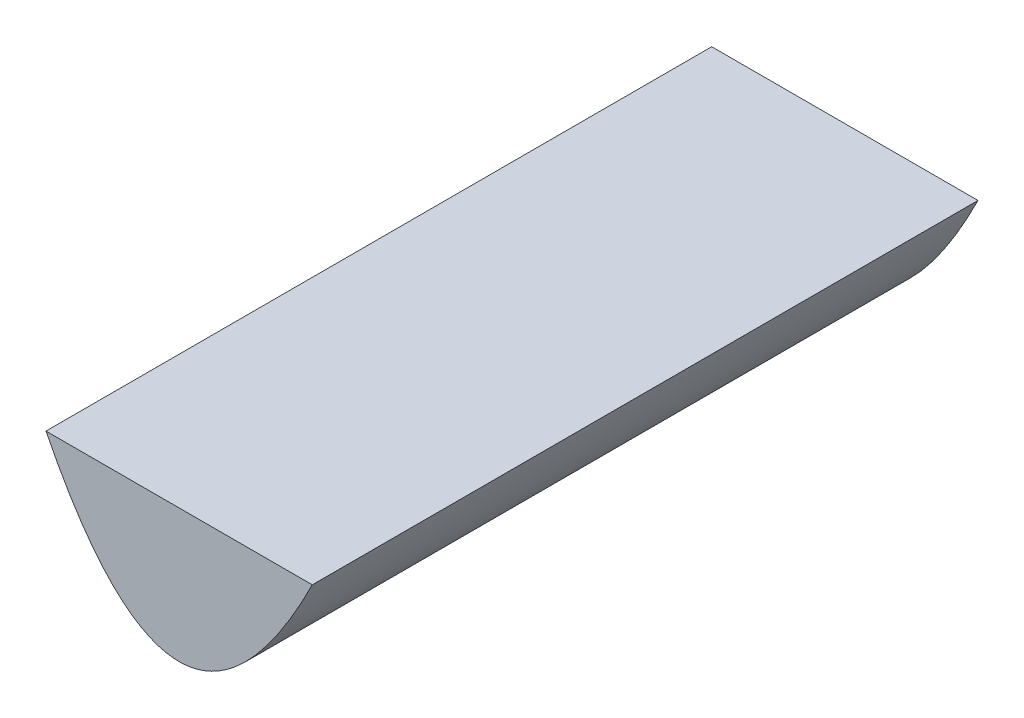
ISO-10303-21;
HEADER;
FILE_DESCRIPTION(('STEP AP214'),'2;1');
FILE_NAME('part.step','',(''),(''),'','','');
FILE_SCHEMA(('AUTOMOTIVE_DESIGN { 1 0 10303 214 1 1 1 1 }'));
ENDSEC;
DATA;
#1=APPLICATION_CONTEXT('core data for automotive mechanical design processes');
#2=APPLICATION_PROTOCOL_DEFINITION('international standard','automotive_design',2000,#1);
#3=PRODUCT_CONTEXT('',#1,'mechanical');
#4=PRODUCT('Part','Part','',(#3));
#5=PRODUCT_RELATED_PRODUCT_CATEGORY('part','',(#4));
#6=PRODUCT_DEFINITION_FORMATION('','',#4);
#7=PRODUCT_DEFINITION_CONTEXT('part definition',#1,'design');
#8=PRODUCT_DEFINITION('design','',#6,#7);
#9=PRODUCT_DEFINITION_SHAPE('','',#8);
#10=(LENGTH_UNIT() NAMED_UNIT(*) SI_UNIT(.MILLI.,.METRE.));
#11=(NAMED_UNIT(*) PLANE_ANGLE_UNIT() SI_UNIT($,.RADIAN.));
#12=(NAMED_UNIT(*) SI_UNIT($,.STERADIAN.) SOLID_ANGLE_UNIT());
#13=UNCERTAINTY_MEASURE_WITH_UNIT(LENGTH_MEASURE(1.E-05),#10,'distance_accuracy_value','');
#14=(GEOMETRIC_REPRESENTATION_CONTEXT(3) GLOBAL_UNCERTAINTY_ASSIGNED_CONTEXT((#13)) GLOBAL_UNIT_ASSIGNED_CONTEXT((#10,
#11,#12)) REPRESENTATION_CONTEXT('',''));
#15=CARTESIAN_POINT('',(0.,0.,0.));
#16=DIRECTION('',(0.,0.,1.));
#17=DIRECTION('',(1.,0.,0.));
#18=AXIS2_PLACEMENT_3D('',#15,#16,#17);
#19=CARTESIAN_POINT('',(-1.58805373498568E-05,-19.0909225266953,329.545454545455));
#20=DIRECTION('',(0.,0.,-1.));
#21=DIRECTION('',(-1.,0.,0.));
#22=AXIS2_PLACEMENT_3D('',#19,#20,#21);
#23=PLANE('',#22);
#24=CARTESIAN_POINT('',(-131.818197698487,112.72725929053,329.545454545455));
#25=CARTESIAN_POINT('',(-1.58805373590035E-05,-150.909104344412,329.545454545455));
#26=CARTESIAN_POINT('',(131.818165937412,112.727259291513,329.545454545455));
#27=B_SPLINE_CURVE_WITH_KNOTS('',2,(#24,#25,#26),.UNSPECIFIED.,.F.,.F.,(3,3),(0.274263764944984,
0.725736235055858),.UNSPECIFIED.);
#28=CARTESIAN_POINT('',(-131.81819769897,112.727259291471,329.545454545455));
#29=VERTEX_POINT('',#28);
#30=CARTESIAN_POINT('',(131.818165937446,112.727259291471,329.545454545455));
#31=VERTEX_POINT('',#30);
#32=EDGE_CURVE('E62',#29,#31,#27,.T.);
#33=ORIENTED_EDGE('',*,*,#32,.T.);
#34=DIRECTION('',(-1.,0.,0.));
#35=VECTOR('',#34,1.);
#36=CARTESIAN_POINT('',(-131.81819769897,112.727259291471,329.545454545455));
#37=LINE('',#36,#35);
#38=EDGE_CURVE('E68',#31,#29,#37,.T.);
#39=ORIENTED_EDGE('',*,*,#38,.T.);
#40=EDGE_LOOP('',(#33,#39));
#41=FACE_BOUND('',#40,.T.);
#42=ADVANCED_FACE('F37',(#41),#23,.F.);
#43=CARTESIAN_POINT('',(-1.58805373498568E-05,-19.0909225266953,-329.545454545455));
#44=DIRECTION('',(0.,0.,-1.));
#45=DIRECTION('',(-1.,0.,0.));
#46=AXIS2_PLACEMENT_3D('',#43,#44,#45);
#47=PLANE('',#46);
#48=CARTESIAN_POINT('',(-131.818197698487,112.72725929053,-329.545454545455));
#49=CARTESIAN_POINT('',(-1.58805373590035E-05,-150.909104344412,-329.545454545455));
#50=CARTESIAN_POINT('',(131.818165937412,112.727259291513,-329.545454545455));
#51=B_SPLINE_CURVE_WITH_KNOTS('',2,(#48,#49,#50),.UNSPECIFIED.,.F.,.F.,(3,3),(0.274263764944984,
0.725736235055858),.UNSPECIFIED.);
#52=CARTESIAN_POINT('',(-131.81819769897,112.727259291471,-329.545454545455));
#53=VERTEX_POINT('',#52);
#54=CARTESIAN_POINT('',(131.818165937446,112.727259291471,-329.545454545455));
#55=VERTEX_POINT('',#54);
#56=EDGE_CURVE('E44',#53,#55,#51,.T.);
#57=ORIENTED_EDGE('',*,*,#56,.F.);
#58=DIRECTION('',(-1.,0.,0.));
#59=VECTOR('',#58,1.);
#60=CARTESIAN_POINT('',(-131.81819769897,112.727259291471,-329.545454545455));
#61=LINE('',#60,#59);
#62=EDGE_CURVE('E11',#55,#53,#61,.T.);
#63=ORIENTED_EDGE('',*,*,#62,.F.);
#64=EDGE_LOOP('',(#57,#63));
#65=FACE_BOUND('',#64,.T.);
#66=ADVANCED_FACE('F89',(#65),#47,.T.);
#67=CARTESIAN_POINT('',(-131.818197698487,112.72725929053,329.545454545455));
#68=CARTESIAN_POINT('',(-131.818197698487,112.72725929053,-329.545454545455));
#69=CARTESIAN_POINT('',(-1.58805373590035E-05,-150.909104344412,329.545454545455));
#70=CARTESIAN_POINT('',(-1.58805373590035E-05,-150.909104344412,-329.545454545455));
#71=CARTESIAN_POINT('',(131.818165937412,112.727259291513,329.545454545455));
#72=CARTESIAN_POINT('',(131.818165937412,112.727259291513,-329.545454545455));
#73=B_SPLINE_SURFACE_WITH_KNOTS('',2,1,((#67,#68),(#69,#70),(#71,#72)),.UNSPECIFIED.,.F.,.F.,
.F.,(3,3),(2,2),(0.,1.),(0.,1.),.UNSPECIFIED.);
#74=DIRECTION('',(0.,0.,-1.));
#75=VECTOR('',#74,1.);
#76=CARTESIAN_POINT('',(131.818165937446,112.727259291471,329.545454545455));
#77=LINE('',#76,#75);
#78=EDGE_CURVE('E66',#31,#55,#77,.T.);
#79=DIRECTION('',(0.,0.,-1.));
#80=VECTOR('',#79,1.);
#81=CARTESIAN_POINT('',(-131.81819769897,112.727259291471,329.545454545455));
#82=LINE('',#81,#80);
#83=EDGE_CURVE('E65',#29,#53,#82,.T.);
#84=ORIENTED_EDGE('',*,*,#78,.F.);
#85=ORIENTED_EDGE('',*,*,#32,.F.);
#86=ORIENTED_EDGE('',*,*,#83,.T.);
#87=ORIENTED_EDGE('',*,*,#56,.T.);
#88=EDGE_LOOP('',(#84,#85,#86,#87));
#89=FACE_BOUND('',#88,.T.);
#90=ADVANCED_FACE('F64',(#89),#73,.F.);
#91=CARTESIAN_POINT('',(-131.81819769897,112.727259291471,329.545454545455));
#92=DIRECTION('',(0.,-1.,0.));
#93=DIRECTION('',(1.,0.,0.));
#94=AXIS2_PLACEMENT_3D('',#91,#92,#93);
#95=PLANE('',#94);
#96=ORIENTED_EDGE('',*,*,#62,.T.);
#97=ORIENTED_EDGE('',*,*,#83,.F.);
#98=ORIENTED_EDGE('',*,*,#38,.F.);
#99=ORIENTED_EDGE('',*,*,#78,.T.);
#100=EDGE_LOOP('',(#96,#97,#98,#99));
#101=FACE_BOUND('',#100,.T.);
#102=ADVANCED_FACE('F70',(#101),#95,.F.);
#103=CLOSED_SHELL('',(#42,#66,#90,#102));
#104=MANIFOLD_SOLID_BREP('B2',#103);
#105=ADVANCED_BREP_SHAPE_REPRESENTATION('',(#18,#104),#14);
#106=SHAPE_DEFINITION_REPRESENTATION(#9,#105);
ENDSEC;
END-ISO-10303-21;
